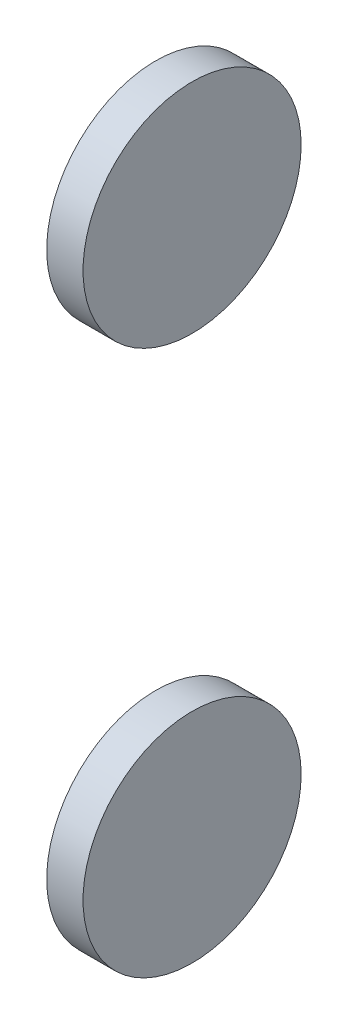
ISO-10303-21;
HEADER;
FILE_DESCRIPTION(('STEP AP214'),'2;1');
FILE_NAME('part.step','',(''),(''),'','','');
FILE_SCHEMA(('AUTOMOTIVE_DESIGN { 1 0 10303 214 1 1 1 1 }'));
ENDSEC;
DATA;
#1=APPLICATION_CONTEXT('core data for automotive mechanical design processes');
#2=APPLICATION_PROTOCOL_DEFINITION('international standard','automotive_design',2000,#1);
#3=PRODUCT_CONTEXT('',#1,'mechanical');
#4=PRODUCT('Part','Part','',(#3));
#5=PRODUCT_RELATED_PRODUCT_CATEGORY('part','',(#4));
#6=PRODUCT_DEFINITION_FORMATION('','',#4);
#7=PRODUCT_DEFINITION_CONTEXT('part definition',#1,'design');
#8=PRODUCT_DEFINITION('design','',#6,#7);
#9=PRODUCT_DEFINITION_SHAPE('','',#8);
#10=(LENGTH_UNIT() NAMED_UNIT(*) SI_UNIT(.MILLI.,.METRE.));
#11=(NAMED_UNIT(*) PLANE_ANGLE_UNIT() SI_UNIT($,.RADIAN.));
#12=(NAMED_UNIT(*) SI_UNIT($,.STERADIAN.) SOLID_ANGLE_UNIT());
#13=UNCERTAINTY_MEASURE_WITH_UNIT(LENGTH_MEASURE(1.E-05),#10,'distance_accuracy_value','');
#14=(GEOMETRIC_REPRESENTATION_CONTEXT(3) GLOBAL_UNCERTAINTY_ASSIGNED_CONTEXT((#13)) GLOBAL_UNIT_ASSIGNED_CONTEXT((#10,
#11,#12)) REPRESENTATION_CONTEXT('',''));
#15=CARTESIAN_POINT('',(0.,0.,0.));
#16=DIRECTION('',(0.,0.,1.));
#17=DIRECTION('',(1.,0.,0.));
#18=AXIS2_PLACEMENT_3D('',#15,#16,#17);
#19=CARTESIAN_POINT('',(31.8,-10.5,-5.));
#20=DIRECTION('',(1.,0.,0.));
#21=DIRECTION('',(0.,0.,-1.));
#22=AXIS2_PLACEMENT_3D('',#19,#20,#21);
#23=PLANE('',#22);
#24=CARTESIAN_POINT('',(31.8,-10.5,-5.));
#25=DIRECTION('',(1.,0.,0.));
#26=DIRECTION('',(0.,0.,-1.));
#27=AXIS2_PLACEMENT_3D('',#24,#25,#26);
#28=CIRCLE('',#27,4.2);
#29=CARTESIAN_POINT('',(31.8,-10.5,-9.2));
#30=VERTEX_POINT('',#29);
#31=EDGE_CURVE('P0_E10',#30,#30,#28,.T.);
#32=ORIENTED_EDGE('',*,*,#31,.F.);
#33=EDGE_LOOP('',(#32));
#34=FACE_BOUND('',#33,.T.);
#35=ADVANCED_FACE('P0_F15',(#34),#23,.F.);
#36=CARTESIAN_POINT('',(33.2,-10.5,-5.));
#37=DIRECTION('',(1.,0.,0.));
#38=DIRECTION('',(0.,0.,-1.));
#39=AXIS2_PLACEMENT_3D('',#36,#37,#38);
#40=PLANE('',#39);
#41=CARTESIAN_POINT('',(33.2,-10.5,-5.));
#42=DIRECTION('',(1.,0.,0.));
#43=DIRECTION('',(0.,0.,-1.));
#44=AXIS2_PLACEMENT_3D('',#41,#42,#43);
#45=CIRCLE('',#44,4.2);
#46=CARTESIAN_POINT('',(33.2,-10.5,-9.2));
#47=VERTEX_POINT('',#46);
#48=EDGE_CURVE('P0_E22',#47,#47,#45,.T.);
#49=ORIENTED_EDGE('',*,*,#48,.T.);
#50=EDGE_LOOP('',(#49));
#51=FACE_BOUND('',#50,.T.);
#52=ADVANCED_FACE('P0_F35',(#51),#40,.T.);
#53=CARTESIAN_POINT('',(31.8,-10.5,-5.));
#54=DIRECTION('',(1.,0.,0.));
#55=DIRECTION('',(0.,0.,-1.));
#56=AXIS2_PLACEMENT_3D('',#53,#54,#55);
#57=CYLINDRICAL_SURFACE('',#56,4.2);
#58=ORIENTED_EDGE('',*,*,#48,.F.);
#59=EDGE_LOOP('',(#58));
#60=FACE_BOUND('',#59,.T.);
#61=ORIENTED_EDGE('',*,*,#31,.T.);
#62=EDGE_LOOP('',(#61));
#63=FACE_BOUND('',#62,.T.);
#64=ADVANCED_FACE('P0_F37',(#60,#63),#57,.T.);
#65=CLOSED_SHELL('',(#35,#52,#64));
#66=MANIFOLD_SOLID_BREP('P0_B1',#65);
#67=CARTESIAN_POINT('',(31.8,10.5,-5.));
#68=DIRECTION('',(1.,0.,0.));
#69=DIRECTION('',(0.,0.,-1.));
#70=AXIS2_PLACEMENT_3D('',#67,#68,#69);
#71=PLANE('',#70);
#72=CARTESIAN_POINT('',(31.8,10.5,-5.));
#73=DIRECTION('',(1.,0.,0.));
#74=DIRECTION('',(0.,0.,-1.));
#75=AXIS2_PLACEMENT_3D('',#72,#73,#74);
#76=CIRCLE('',#75,4.2);
#77=CARTESIAN_POINT('',(31.8,10.5,-9.2));
#78=VERTEX_POINT('',#77);
#79=EDGE_CURVE('P1_E9',#78,#78,#76,.T.);
#80=ORIENTED_EDGE('',*,*,#79,.F.);
#81=EDGE_LOOP('',(#80));
#82=FACE_BOUND('',#81,.T.);
#83=ADVANCED_FACE('P1_F14',(#82),#71,.F.);
#84=CARTESIAN_POINT('',(33.2,10.5,-5.));
#85=DIRECTION('',(1.,0.,0.));
#86=DIRECTION('',(0.,0.,-1.));
#87=AXIS2_PLACEMENT_3D('',#84,#85,#86);
#88=PLANE('',#87);
#89=CARTESIAN_POINT('',(33.2,10.5,-5.));
#90=DIRECTION('',(1.,0.,0.));
#91=DIRECTION('',(0.,0.,-1.));
#92=AXIS2_PLACEMENT_3D('',#89,#90,#91);
#93=CIRCLE('',#92,4.2);
#94=CARTESIAN_POINT('',(33.2,10.5,-9.2));
#95=VERTEX_POINT('',#94);
#96=EDGE_CURVE('P1_E21',#95,#95,#93,.T.);
#97=ORIENTED_EDGE('',*,*,#96,.T.);
#98=EDGE_LOOP('',(#97));
#99=FACE_BOUND('',#98,.T.);
#100=ADVANCED_FACE('P1_F34',(#99),#88,.T.);
#101=CARTESIAN_POINT('',(31.8,10.5,-5.));
#102=DIRECTION('',(1.,0.,0.));
#103=DIRECTION('',(0.,0.,-1.));
#104=AXIS2_PLACEMENT_3D('',#101,#102,#103);
#105=CYLINDRICAL_SURFACE('',#104,4.2);
#106=ORIENTED_EDGE('',*,*,#96,.F.);
#107=EDGE_LOOP('',(#106));
#108=FACE_BOUND('',#107,.T.);
#109=ORIENTED_EDGE('',*,*,#79,.T.);
#110=EDGE_LOOP('',(#109));
#111=FACE_BOUND('',#110,.T.);
#112=ADVANCED_FACE('P1_F36',(#108,#111),#105,.T.);
#113=CLOSED_SHELL('',(#83,#100,#112));
#114=MANIFOLD_SOLID_BREP('P1_B1',#113);
#115=ADVANCED_BREP_SHAPE_REPRESENTATION('',(#18,#66,#114),#14);
#116=SHAPE_DEFINITION_REPRESENTATION(#9,#115);
ENDSEC;
END-ISO-10303-21;
